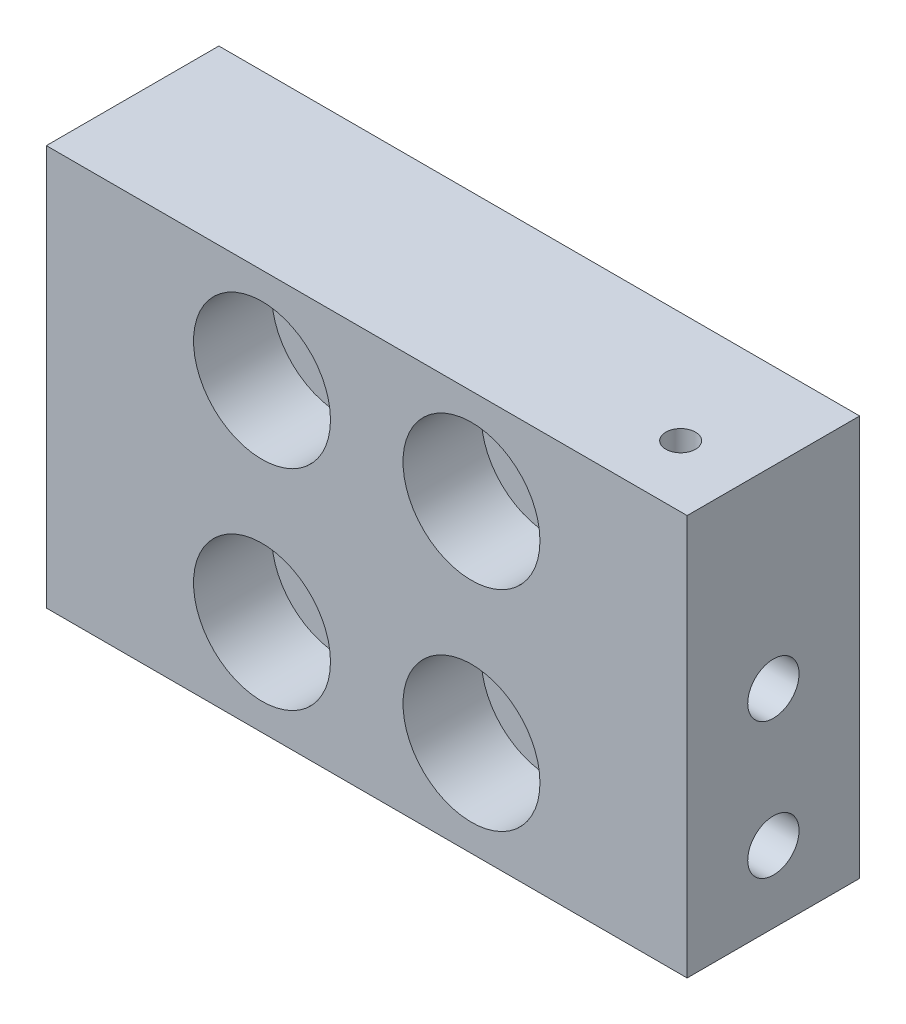
ISO-10303-21;
HEADER;
FILE_DESCRIPTION(('STEP AP214'),'2;1');
FILE_NAME('part.step','',(''),(''),'','','');
FILE_SCHEMA(('AUTOMOTIVE_DESIGN { 1 0 10303 214 1 1 1 1 }'));
ENDSEC;
DATA;
#1=APPLICATION_CONTEXT('core data for automotive mechanical design processes');
#2=APPLICATION_PROTOCOL_DEFINITION('international standard','automotive_design',2000,#1);
#3=PRODUCT_CONTEXT('',#1,'mechanical');
#4=PRODUCT('Part','Part','',(#3));
#5=PRODUCT_RELATED_PRODUCT_CATEGORY('part','',(#4));
#6=PRODUCT_DEFINITION_FORMATION('','',#4);
#7=PRODUCT_DEFINITION_CONTEXT('part definition',#1,'design');
#8=PRODUCT_DEFINITION('design','',#6,#7);
#9=PRODUCT_DEFINITION_SHAPE('','',#8);
#10=(LENGTH_UNIT() NAMED_UNIT(*) SI_UNIT(.MILLI.,.METRE.));
#11=(NAMED_UNIT(*) PLANE_ANGLE_UNIT() SI_UNIT($,.RADIAN.));
#12=(NAMED_UNIT(*) SI_UNIT($,.STERADIAN.) SOLID_ANGLE_UNIT());
#13=UNCERTAINTY_MEASURE_WITH_UNIT(LENGTH_MEASURE(1.E-05),#10,'distance_accuracy_value','');
#14=(GEOMETRIC_REPRESENTATION_CONTEXT(3) GLOBAL_UNCERTAINTY_ASSIGNED_CONTEXT((#13)) GLOBAL_UNIT_ASSIGNED_CONTEXT((#10,
#11,#12)) REPRESENTATION_CONTEXT('',''));
#15=CARTESIAN_POINT('',(0.,0.,0.));
#16=DIRECTION('',(0.,0.,1.));
#17=DIRECTION('',(1.,0.,0.));
#18=AXIS2_PLACEMENT_3D('',#15,#16,#17);
#19=CARTESIAN_POINT('',(11.9761,-16.25,9.));
#20=DIRECTION('',(0.,1.,0.));
#21=DIRECTION('',(0.,0.,1.));
#22=AXIS2_PLACEMENT_3D('',#19,#20,#21);
#23=CYLINDRICAL_SURFACE('',#22,1.2065);
#24=CARTESIAN_POINT('',(11.9761,-16.25,9.));
#25=DIRECTION('',(0.,1.,0.));
#26=DIRECTION('',(0.,0.,1.));
#27=AXIS2_PLACEMENT_3D('',#24,#25,#26);
#28=CIRCLE('',#27,1.2065);
#29=CARTESIAN_POINT('',(11.9761,-16.25,10.2065));
#30=VERTEX_POINT('',#29);
#31=EDGE_CURVE('E126',#30,#30,#28,.T.);
#32=ORIENTED_EDGE('',*,*,#31,.F.);
#33=EDGE_LOOP('',(#32));
#34=FACE_BOUND('',#33,.T.);
#35=CARTESIAN_POINT('',(11.9761,16.25,9.));
#36=DIRECTION('',(0.,1.,0.));
#37=DIRECTION('',(0.,0.,1.));
#38=AXIS2_PLACEMENT_3D('',#35,#36,#37);
#39=CIRCLE('',#38,1.2065);
#40=CARTESIAN_POINT('',(11.9761,16.25,10.2065));
#41=VERTEX_POINT('',#40);
#42=EDGE_CURVE('E125',#41,#41,#39,.T.);
#43=ORIENTED_EDGE('',*,*,#42,.T.);
#44=EDGE_LOOP('',(#43));
#45=FACE_BOUND('',#44,.T.);
#46=CARTESIAN_POINT('',(11.9761,-12.3611241729037,7.7935));
#47=CARTESIAN_POINT('',(12.0383119779317,-12.3611236387909,7.79349881396645));
#48=CARTESIAN_POINT('',(12.1005143925119,-12.3591562258355,7.79832668260524));
#49=CARTESIAN_POINT('',(12.2231668409252,-12.3511128608083,7.81743954220052));
#50=CARTESIAN_POINT('',(12.2836173712679,-12.3450380849368,7.83172182572965));
#51=CARTESIAN_POINT('',(12.4011007603259,-12.3282946631669,7.86915090768095));
#52=CARTESIAN_POINT('',(12.4581307024141,-12.3176221586285,7.8923051500785));
#53=CARTESIAN_POINT('',(12.5670447521251,-12.2910207306071,7.94637750279822));
#54=CARTESIAN_POINT('',(12.6189299995996,-12.2750929748702,7.97729388796464));
#55=CARTESIAN_POINT('',(12.715541819595,-12.2375659833419,8.04485523111553));
#56=CARTESIAN_POINT('',(12.7603460153974,-12.2160362716513,8.08142787822304));
#57=CARTESIAN_POINT('',(12.8425553175484,-12.1668598967251,8.15852834133076));
#58=CARTESIAN_POINT('',(12.879961185915,-12.1392138640845,8.19905574935305));
#59=CARTESIAN_POINT('',(12.9473173052903,-12.0775838741529,8.28217833544783));
#60=CARTESIAN_POINT('',(12.9772026674372,-12.0435489035243,8.3247879582766));
#61=CARTESIAN_POINT('',(13.0294618518609,-11.9697473311672,8.4096115711156));
#62=CARTESIAN_POINT('',(13.051832276449,-11.9299781484423,8.45182537380369));
#63=CARTESIAN_POINT('',(13.097098191719,-11.8294889962294,8.54955753410343));
#64=CARTESIAN_POINT('',(13.1170391797819,-11.7665080635163,8.60412250074922));
#65=CARTESIAN_POINT('',(13.1474918366299,-11.6329629439601,8.70617152492492));
#66=CARTESIAN_POINT('',(13.1579816694659,-11.5623816158427,8.75363897458048));
#67=CARTESIAN_POINT('',(13.1748809708069,-11.3938789773443,8.85242336437642));
#68=CARTESIAN_POINT('',(13.179194021647,-11.2940068400315,8.90079240055414));
#69=CARTESIAN_POINT('',(13.1821310557092,-11.139495405582,8.96096650496947));
#70=CARTESIAN_POINT('',(13.1825202645124,-11.08716636273,8.97897021874505));
#71=CARTESIAN_POINT('',(13.1826578821386,-10.9812452064991,9.01076033561725));
#72=CARTESIAN_POINT('',(13.1824065539403,-10.9276536204205,9.0245484668596));
#73=CARTESIAN_POINT('',(13.1817037111867,-10.818860884585,9.04796280139382));
#74=CARTESIAN_POINT('',(13.1812496869418,-10.7636479271729,9.0575337412958));
#75=CARTESIAN_POINT('',(13.180460523308,-10.6526462170997,9.07219500276255));
#76=CARTESIAN_POINT('',(13.1801253454501,-10.5968576567809,9.07728677495961));
#77=CARTESIAN_POINT('',(13.1797477338167,-10.4850393978561,9.08296098133241));
#78=CARTESIAN_POINT('',(13.1797053589444,-10.4290096529992,9.08354250818209));
#79=CARTESIAN_POINT('',(13.1799331855513,-10.3171035152043,9.08019097922646));
#80=CARTESIAN_POINT('',(13.1802032934259,-10.2612270813665,9.07625927536625));
#81=CARTESIAN_POINT('',(13.1809384786253,-10.1474502568247,9.06362869508976));
#82=CARTESIAN_POINT('',(13.1814118367997,-10.0895728981691,9.05472185585733));
#83=CARTESIAN_POINT('',(13.1822268730326,-9.97476682655516,9.03206724862103));
#84=CARTESIAN_POINT('',(13.1825685357618,-9.91783822476958,9.01831891742352));
#85=CARTESIAN_POINT('',(13.1826274637689,-9.80533541808021,8.98607580640679));
#86=CARTESIAN_POINT('',(13.1823447292764,-9.74976121267887,8.96758102833129));
#87=CARTESIAN_POINT('',(13.1805069595549,-9.64038375508712,8.92598854678094));
#88=CARTESIAN_POINT('',(13.1789517526071,-9.58658074293699,8.90289022238017));
#89=CARTESIAN_POINT('',(13.1723261437177,-9.45115387662476,8.83785713839302));
#90=CARTESIAN_POINT('',(13.1657593707839,-9.37111431333943,8.79268167643362));
#91=CARTESIAN_POINT('',(13.1439529520485,-9.21857286725036,8.69282371295792));
#92=CARTESIAN_POINT('',(13.1287314823338,-9.14605556284813,8.638161301998));
#93=CARTESIAN_POINT('',(13.0904790218146,-9.02608149687989,8.53513955113254));
#94=CARTESIAN_POINT('',(13.06998409935,-8.97666163024319,8.48813972383422));
#95=CARTESIAN_POINT('',(13.0197268069286,-8.88485152955717,8.39221027026685));
#96=CARTESIAN_POINT('',(12.9899702379862,-8.84245692065178,8.3432818686642));
#97=CARTESIAN_POINT('',(12.9199530649913,-8.76530648444544,8.24608403849458));
#98=CARTESIAN_POINT('',(12.8796176955222,-8.73060841029168,8.19782198310517));
#99=CARTESIAN_POINT('',(12.7886992862244,-8.66955831196966,8.10585507844628));
#100=CARTESIAN_POINT('',(12.7381196616154,-8.6432035138136,8.06214871773962));
#101=CARTESIAN_POINT('',(12.6346912458826,-8.60104870703754,7.98733933726073));
#102=CARTESIAN_POINT('',(12.5828340463822,-8.58436430724908,7.95535463689008));
#103=CARTESIAN_POINT('',(12.473710279291,-8.55643575098531,7.89918676157466));
#104=CARTESIAN_POINT('',(12.4164439625564,-8.54519134236976,7.87500322506808));
#105=CARTESIAN_POINT('',(12.2996424788821,-8.52766851156287,7.836099970585));
#106=CARTESIAN_POINT('',(12.240195050468,-8.52127711741912,7.82116655348251));
#107=CARTESIAN_POINT('',(12.1194358595113,-8.51253337229733,7.80047917230831));
#108=CARTESIAN_POINT('',(12.0581240295913,-8.51018116746813,7.79472554038673));
#109=CARTESIAN_POINT('',(11.9342888551643,-8.5093084902637,7.79260934459159));
#110=CARTESIAN_POINT('',(11.8717623100366,-8.51085234594718,7.79640443713456));
#111=CARTESIAN_POINT('',(11.7482735698928,-8.51804513411795,7.81356711170897));
#112=CARTESIAN_POINT('',(11.6873114425376,-8.52369424384823,7.82693510704696));
#113=CARTESIAN_POINT('',(11.5685888600515,-8.53957114113604,7.86271086382679));
#114=CARTESIAN_POINT('',(11.5108348274572,-8.54980776601762,7.88513606466612));
#115=CARTESIAN_POINT('',(11.400372888988,-8.57552316781073,7.93796153352725));
#116=CARTESIAN_POINT('',(11.3476635328762,-8.59100043230884,7.96835950009251));
#117=CARTESIAN_POINT('',(11.2495690491665,-8.62756261076003,8.03498499390508));
#118=CARTESIAN_POINT('',(11.2040799170064,-8.64855350378798,8.07111109136295));
#119=CARTESIAN_POINT('',(11.1204480728513,-8.69664419436279,8.1475262765263));
#120=CARTESIAN_POINT('',(11.0823044140844,-8.72374320364454,8.18781482669553));
#121=CARTESIAN_POINT('',(11.0135759536863,-8.78421904081054,8.27054755544945));
#122=CARTESIAN_POINT('',(10.9830336283603,-8.81762938858489,8.31300231728557));
#123=CARTESIAN_POINT('',(10.9294879045943,-8.8902131314091,8.39770300605257));
#124=CARTESIAN_POINT('',(10.9064878021128,-8.9293890352068,8.43994883375759));
#125=CARTESIAN_POINT('',(10.8600561888807,-9.02801503530024,8.53743010688584));
#126=CARTESIAN_POINT('',(10.839498895318,-9.08966243461326,8.59181396493464));
#127=CARTESIAN_POINT('',(10.8078641660125,-9.22052692402256,8.69383615798838));
#128=CARTESIAN_POINT('',(10.7968082511592,-9.28976080020903,8.74145897661204));
#129=CARTESIAN_POINT('',(10.778725755807,-9.45555235755235,8.84115784529109));
#130=CARTESIAN_POINT('',(10.7738815060513,-9.55410457669837,8.89033235810981));
#131=CARTESIAN_POINT('',(10.7703855699488,-9.70673525222016,8.95195896081184));
#132=CARTESIAN_POINT('',(10.7698497477498,-9.75845580097478,8.97048857932395));
#133=CARTESIAN_POINT('',(10.7694914467242,-9.86319712293093,9.00340811650867));
#134=CARTESIAN_POINT('',(10.7696686781475,-9.91621735929976,9.01779971412394));
#135=CARTESIAN_POINT('',(10.7702853348799,-10.0239710220619,9.04251875130013));
#136=CARTESIAN_POINT('',(10.7707283938557,-10.0787180390916,9.05278651201727));
#137=CARTESIAN_POINT('',(10.7715420170496,-10.1888426878129,9.06890315851663));
#138=CARTESIAN_POINT('',(10.7719126044134,-10.24422011217,9.07475345683517));
#139=CARTESIAN_POINT('',(10.7723844265525,-10.3552738948071,9.08200205897306));
#140=CARTESIAN_POINT('',(10.7724856269944,-10.4109502902852,9.08339979531408));
#141=CARTESIAN_POINT('',(10.7723714247494,-10.5222187128029,9.08173327190616));
#142=CARTESIAN_POINT('',(10.772156115723,-10.57781075993,9.0786703321471));
#143=CARTESIAN_POINT('',(10.771495273185,-10.6914319147729,9.06783120604967));
#144=CARTESIAN_POINT('',(10.7710384271584,-10.749438659161,9.05981984027984));
#145=CARTESIAN_POINT('',(10.7701835565862,-10.8645776092144,9.0389425264205));
#146=CARTESIAN_POINT('',(10.7697855387949,-10.9217097137862,9.02607602150181));
#147=CARTESIAN_POINT('',(10.7695115918356,-11.0347003919358,8.99557464186717));
#148=CARTESIAN_POINT('',(10.769635724389,-11.0905588141721,8.97793920366524));
#149=CARTESIAN_POINT('',(10.7710276911236,-11.2005819451539,8.93803519469192));
#150=CARTESIAN_POINT('',(10.7722957025577,-11.2547463900586,8.91576590628132));
#151=CARTESIAN_POINT('',(10.7780426212818,-11.3925859762127,8.85217200463999));
#152=CARTESIAN_POINT('',(10.7839826971093,-11.4746527610356,8.80739158026255));
#153=CARTESIAN_POINT('',(10.8044189562643,-11.631221974106,8.70781317183943));
#154=CARTESIAN_POINT('',(10.8188971756155,-11.7057399003082,8.65303638641766));
#155=CARTESIAN_POINT('',(10.8557774979678,-11.8287518220049,8.549681888407));
#156=CARTESIAN_POINT('',(10.8755689409421,-11.8792765650803,8.50260517407781));
#157=CARTESIAN_POINT('',(10.9244387146602,-11.9732832897793,8.4062316287071));
#158=CARTESIAN_POINT('',(10.9535111030611,-12.0167697510523,8.35693623552796));
#159=CARTESIAN_POINT('',(11.0223041789892,-12.096049476103,8.25869657016133));
#160=CARTESIAN_POINT('',(11.0621047119353,-12.1317812704478,8.20975787840219));
#161=CARTESIAN_POINT('',(11.1522011131425,-12.1947343948227,8.11623708971265));
#162=CARTESIAN_POINT('',(11.202492158449,-12.2219596213825,8.0716530045577));
#163=CARTESIAN_POINT('',(11.3053852432534,-12.265448221024,7.99532583493407));
#164=CARTESIAN_POINT('',(11.3569230260869,-12.2826535033987,7.96267546255783));
#165=CARTESIAN_POINT('',(11.4655824293314,-12.3115345642055,7.90510521567265));
#166=CARTESIAN_POINT('',(11.5227054939253,-12.3232089079206,7.88018734754102));
#167=CARTESIAN_POINT('',(11.6445664186653,-12.3423125041103,7.83804302379233));
#168=CARTESIAN_POINT('',(11.709557441338,-12.3494257831532,7.82140418998091));
#169=CARTESIAN_POINT('',(11.8417359618763,-12.3588320119163,7.79913307638889));
#170=CARTESIAN_POINT('',(11.908923556211,-12.3611247496382,7.79350128067807));
#171=CARTESIAN_POINT('',(11.9761,-12.3611241729037,7.7935));
#172=B_SPLINE_CURVE_WITH_KNOTS('',3,(#46,#47,#48,#49,#50,#51,#52,#53,#54,#55,#56,#57,#58,#59,
#60,#61,#62,#63,#64,#65,#66,#67,#68,#69,#70,#71,#72,#73,#74,#75,#76,#77,#78,#79,#80,#81,#82,#83,
#84,#85,#86,#87,#88,#89,#90,#91,#92,#93,#94,#95,#96,#97,#98,#99,#100,#101,#102,#103,#104,#105,
#106,#107,#108,#109,#110,#111,#112,#113,#114,#115,#116,#117,#118,#119,#120,#121,#122,#123,#124,
#125,#126,#127,#128,#129,#130,#131,#132,#133,#134,#135,#136,#137,#138,#139,#140,#141,#142,#143,
#144,#145,#146,#147,#148,#149,#150,#151,#152,#153,#154,#155,#156,#157,#158,#159,#160,#161,#162,
#163,#164,#165,#166,#167,#168,#169,#170,#171),.UNSPECIFIED.,.T.,.F.,(4,2,2,2,2,2,2,2,2,2,2,2,2,
2,2,2,2,2,2,2,2,2,2,2,2,2,2,2,2,2,2,2,2,2,2,2,2,2,2,2,2,2,2,2,2,2,2,2,2,2,2,2,2,2,2,2,2,2,2,2,2,
2,4),(0.,0.186401806859428,0.372750257570939,0.559255406670589,0.745719141168997,
0.929970800667106,1.11420347259521,1.29997508984819,1.48583058634046,1.7414454610358,
1.99764940509129,2.3289293526065,2.49482044113129,2.6606434324096,2.82857910079176,
2.99646036114565,3.16437539329704,3.33224013936858,3.50771213104172,3.68320454149728,
3.85869688748144,4.03421291989635,4.30957147233566,4.58435385765511,4.79715398264588,
5.00982108800295,5.22403373002698,5.43817507525297,5.62675433546043,5.8153248542979,
5.99935838678965,6.18339857797483,6.37049727844315,6.55760405731621,6.74507283582274,
6.93248755814427,7.11689331724739,7.30127529201513,7.48666556026505,7.67213673660573,
7.92493529406673,8.17830494948559,8.50717350421254,8.67187127950187,8.8365021364287,
9.00343634665379,9.17031715504197,9.33721923151238,9.50407192885578,9.6795392027708,
9.85502660690296,10.0305347552819,10.2060701046689,10.4860070435623,10.7653570950444,
10.9800307228843,11.1945671756516,11.4107466682866,11.6268269917932,11.8160488404204,
12.0053197460647,12.2065874161629,12.4078639374527),.UNSPECIFIED.);
#173=CARTESIAN_POINT('',(11.9761,-12.3611241729037,7.7935));
#174=VERTEX_POINT('',#173);
#175=EDGE_CURVE('E160',#174,#174,#172,.T.);
#176=ORIENTED_EDGE('',*,*,#175,.F.);
#177=EDGE_LOOP('',(#176));
#178=FACE_BOUND('',#177,.T.);
#179=CARTESIAN_POINT('',(11.9761,-1.33752417290366,7.7935));
#180=CARTESIAN_POINT('',(12.0383119779317,-1.33752363879088,7.79349881396645));
#181=CARTESIAN_POINT('',(12.1005143925119,-1.33555622583548,7.79832668260524));
#182=CARTESIAN_POINT('',(12.2231668409252,-1.32751286080826,7.81743954220052));
#183=CARTESIAN_POINT('',(12.2836173712679,-1.3214380849368,7.83172182572965));
#184=CARTESIAN_POINT('',(12.4011007603259,-1.30469466316687,7.86915090768095));
#185=CARTESIAN_POINT('',(12.4581307024141,-1.29402215862845,7.8923051500785));
#186=CARTESIAN_POINT('',(12.5670447521251,-1.26742073060709,7.94637750279822));
#187=CARTESIAN_POINT('',(12.6189299995996,-1.25149297487016,7.97729388796464));
#188=CARTESIAN_POINT('',(12.715541819595,-1.21396598334187,8.04485523111553));
#189=CARTESIAN_POINT('',(12.7603460153974,-1.19243627165134,8.08142787822304));
#190=CARTESIAN_POINT('',(12.8425553175484,-1.14325989672514,8.15852834133076));
#191=CARTESIAN_POINT('',(12.879961185915,-1.11561386408445,8.19905574935305));
#192=CARTESIAN_POINT('',(12.9473173052903,-1.05398387415285,8.28217833544783));
#193=CARTESIAN_POINT('',(12.9772026674372,-1.01994890352428,8.3247879582766));
#194=CARTESIAN_POINT('',(13.0294618518609,-0.946147331167149,8.4096115711156));
#195=CARTESIAN_POINT('',(13.051832276449,-0.906378148442319,8.45182537380369));
#196=CARTESIAN_POINT('',(13.097098191719,-0.805888996229398,8.54955753410343));
#197=CARTESIAN_POINT('',(13.1170391797819,-0.742908063516255,8.60412250074922));
#198=CARTESIAN_POINT('',(13.1474918366299,-0.609362943960055,8.70617152492492));
#199=CARTESIAN_POINT('',(13.1579816694659,-0.538781615842697,8.75363897458048));
#200=CARTESIAN_POINT('',(13.1748809708069,-0.370278977344246,8.85242336437642));
#201=CARTESIAN_POINT('',(13.179194021647,-0.270406840031512,8.90079240055414));
#202=CARTESIAN_POINT('',(13.1821310557092,-0.115895405582001,8.96096650496947));
#203=CARTESIAN_POINT('',(13.1825202645124,-0.0635663627299739,8.97897021874505));
#204=CARTESIAN_POINT('',(13.1826578821386,0.0423547935008736,9.01076033561725));
#205=CARTESIAN_POINT('',(13.1824065539403,0.0959463795794926,9.0245484668596));
#206=CARTESIAN_POINT('',(13.1817037111867,0.204739115414988,9.04796280139382));
#207=CARTESIAN_POINT('',(13.1812496869418,0.25995207282708,9.0575337412958));
#208=CARTESIAN_POINT('',(13.180460523308,0.370953782900275,9.07219500276255));
#209=CARTESIAN_POINT('',(13.1801253454501,0.426742343219074,9.07728677495961));
#210=CARTESIAN_POINT('',(13.1797477338167,0.538560602143896,9.08296098133241));
#211=CARTESIAN_POINT('',(13.1797053589444,0.594590347000839,9.08354250818209));
#212=CARTESIAN_POINT('',(13.1799331855513,0.706496484795753,9.08019097922646));
#213=CARTESIAN_POINT('',(13.1802032934259,0.76237291863355,9.07625927536625));
#214=CARTESIAN_POINT('',(13.1809384786253,0.876149743175353,9.06362869508976));
#215=CARTESIAN_POINT('',(13.1814118367997,0.934027101830917,9.05472185585733));
#216=CARTESIAN_POINT('',(13.1822268730326,1.04883317344484,9.03206724862103));
#217=CARTESIAN_POINT('',(13.1825685357618,1.10576177523043,9.01831891742352));
#218=CARTESIAN_POINT('',(13.1826274637689,1.2182645819198,8.98607580640678));
#219=CARTESIAN_POINT('',(13.1823447292764,1.27383878732114,8.96758102833129));
#220=CARTESIAN_POINT('',(13.1805069595549,1.38321624491288,8.92598854678094));
#221=CARTESIAN_POINT('',(13.1789517526071,1.43701925706302,8.90289022238016));
#222=CARTESIAN_POINT('',(13.1723261437177,1.57244612337525,8.83785713839302));
#223=CARTESIAN_POINT('',(13.1657593707839,1.65248568666057,8.79268167643362));
#224=CARTESIAN_POINT('',(13.1439529520485,1.80502713274964,8.69282371295792));
#225=CARTESIAN_POINT('',(13.1287314823338,1.87754443715187,8.638161301998));
#226=CARTESIAN_POINT('',(13.0904790218146,1.99751850312011,8.53513955113254));
#227=CARTESIAN_POINT('',(13.06998409935,2.04693836975681,8.48813972383422));
#228=CARTESIAN_POINT('',(13.0197268069286,2.13874847044284,8.39221027026685));
#229=CARTESIAN_POINT('',(12.9899702379862,2.18114307934822,8.3432818686642));
#230=CARTESIAN_POINT('',(12.9199530649913,2.25829351555456,8.24608403849458));
#231=CARTESIAN_POINT('',(12.8796176955222,2.29299158970832,8.19782198310517));
#232=CARTESIAN_POINT('',(12.7886992862244,2.35404168803034,8.10585507844628));
#233=CARTESIAN_POINT('',(12.7381196616154,2.3803964861864,8.06214871773962));
#234=CARTESIAN_POINT('',(12.6346912458826,2.42255129296246,7.98733933726073));
#235=CARTESIAN_POINT('',(12.5828340463822,2.43923569275092,7.95535463689008));
#236=CARTESIAN_POINT('',(12.473710279291,2.46716424901469,7.89918676157466));
#237=CARTESIAN_POINT('',(12.4164439625564,2.47840865763024,7.87500322506808));
#238=CARTESIAN_POINT('',(12.2996424788821,2.49593148843714,7.836099970585));
#239=CARTESIAN_POINT('',(12.240195050468,2.50232288258088,7.82116655348251));
#240=CARTESIAN_POINT('',(12.1194358595113,2.51106662770268,7.80047917230831));
#241=CARTESIAN_POINT('',(12.0581240295913,2.51341883253187,7.79472554038673));
#242=CARTESIAN_POINT('',(11.9342888551643,2.5142915097363,7.79260934459159));
#243=CARTESIAN_POINT('',(11.8717623100366,2.51274765405282,7.79640443713456));
#244=CARTESIAN_POINT('',(11.7482735698928,2.50555486588205,7.81356711170897));
#245=CARTESIAN_POINT('',(11.6873114425376,2.49990575615177,7.82693510704696));
#246=CARTESIAN_POINT('',(11.5685888600515,2.48402885886396,7.86271086382679));
#247=CARTESIAN_POINT('',(11.5108348274572,2.47379223398238,7.88513606466612));
#248=CARTESIAN_POINT('',(11.400372888988,2.44807683218927,7.93796153352725));
#249=CARTESIAN_POINT('',(11.3476635328762,2.43259956769116,7.96835950009251));
#250=CARTESIAN_POINT('',(11.2495690491665,2.39603738923997,8.03498499390508));
#251=CARTESIAN_POINT('',(11.2040799170064,2.37504649621203,8.07111109136295));
#252=CARTESIAN_POINT('',(11.1204480728513,2.32695580563721,8.1475262765263));
#253=CARTESIAN_POINT('',(11.0823044140844,2.29985679635546,8.18781482669553));
#254=CARTESIAN_POINT('',(11.0135759536863,2.23938095918946,8.27054755544945));
#255=CARTESIAN_POINT('',(10.9830336283603,2.20597061141511,8.31300231728557));
#256=CARTESIAN_POINT('',(10.9294879045943,2.1333868685909,8.39770300605257));
#257=CARTESIAN_POINT('',(10.9064878021128,2.0942109647932,8.43994883375759));
#258=CARTESIAN_POINT('',(10.8600561888807,1.99558496469977,8.53743010688584));
#259=CARTESIAN_POINT('',(10.839498895318,1.93393756538675,8.59181396493464));
#260=CARTESIAN_POINT('',(10.8078641660125,1.80307307597744,8.69383615798838));
#261=CARTESIAN_POINT('',(10.7968082511592,1.73383919979097,8.74145897661204));
#262=CARTESIAN_POINT('',(10.778725755807,1.56804764244765,8.84115784529109));
#263=CARTESIAN_POINT('',(10.7738815060513,1.46949542330162,8.89033235810981));
#264=CARTESIAN_POINT('',(10.7703855699488,1.31686474777984,8.95195896081184));
#265=CARTESIAN_POINT('',(10.7698497477498,1.26514419902522,8.97048857932395));
#266=CARTESIAN_POINT('',(10.7694914467242,1.16040287706907,9.00340811650867));
#267=CARTESIAN_POINT('',(10.7696686781475,1.10738264070025,9.01779971412394));
#268=CARTESIAN_POINT('',(10.7702853348799,0.999628977938054,9.04251875130013));
#269=CARTESIAN_POINT('',(10.7707283938557,0.94488196090842,9.05278651201727));
#270=CARTESIAN_POINT('',(10.7715420170496,0.834757312187129,9.06890315851663));
#271=CARTESIAN_POINT('',(10.7719126044134,0.779379887830031,9.07475345683517));
#272=CARTESIAN_POINT('',(10.7723844265525,0.668326105192919,9.08200205897306));
#273=CARTESIAN_POINT('',(10.7724856269944,0.612649709714796,9.08339979531408));
#274=CARTESIAN_POINT('',(10.7723714247494,0.501381287197125,9.08173327190616));
#275=CARTESIAN_POINT('',(10.772156115723,0.445789240070022,9.0786703321471));
#276=CARTESIAN_POINT('',(10.771495273185,0.332168085227137,9.06783120604967));
#277=CARTESIAN_POINT('',(10.7710384271584,0.274161340839019,9.05981984027984));
#278=CARTESIAN_POINT('',(10.7701835565862,0.159022390785575,9.0389425264205));
#279=CARTESIAN_POINT('',(10.7697855387949,0.101890286213833,9.02607602150181));
#280=CARTESIAN_POINT('',(10.7695115918356,-0.0111003919358057,8.99557464186717));
#281=CARTESIAN_POINT('',(10.769635724389,-0.0669588141721376,8.97793920366524));
#282=CARTESIAN_POINT('',(10.7710276911236,-0.176981945153889,8.93803519469192));
#283=CARTESIAN_POINT('',(10.7722957025577,-0.231146390058577,8.91576590628132));
#284=CARTESIAN_POINT('',(10.7780426212818,-0.368985976212688,8.85217200464));
#285=CARTESIAN_POINT('',(10.7839826971093,-0.451052761035571,8.80739158026255));
#286=CARTESIAN_POINT('',(10.8044189562643,-0.607621974106028,8.70781317183943));
#287=CARTESIAN_POINT('',(10.8188971756155,-0.682139900308188,8.65303638641766));
#288=CARTESIAN_POINT('',(10.8557774979678,-0.805151822004866,8.549681888407));
#289=CARTESIAN_POINT('',(10.8755689409421,-0.855676565080313,8.50260517407781));
#290=CARTESIAN_POINT('',(10.9244387146602,-0.949683289779268,8.4062316287071));
#291=CARTESIAN_POINT('',(10.9535111030611,-0.993169751052314,8.35693623552797));
#292=CARTESIAN_POINT('',(11.0223041789892,-1.07244947610301,8.25869657016134));
#293=CARTESIAN_POINT('',(11.0621047119353,-1.10818127044777,8.2097578784022));
#294=CARTESIAN_POINT('',(11.1522011131425,-1.17113439482271,8.11623708971266));
#295=CARTESIAN_POINT('',(11.202492158449,-1.19835962138253,8.07165300455771));
#296=CARTESIAN_POINT('',(11.3053852432534,-1.24184822102398,7.99532583493407));
#297=CARTESIAN_POINT('',(11.3569230260869,-1.25905350339869,7.96267546255784));
#298=CARTESIAN_POINT('',(11.4655824293314,-1.28793456420549,7.90510521567265));
#299=CARTESIAN_POINT('',(11.5227054939253,-1.29960890792062,7.88018734754103));
#300=CARTESIAN_POINT('',(11.6445664186653,-1.31871250411031,7.83804302379233));
#301=CARTESIAN_POINT('',(11.709557441338,-1.32582578315315,7.82140418998091));
#302=CARTESIAN_POINT('',(11.8417359618763,-1.3352320119163,7.79913307638889));
#303=CARTESIAN_POINT('',(11.908923556211,-1.3375247496382,7.79350128067807));
#304=CARTESIAN_POINT('',(11.9761,-1.33752417290366,7.7935));
#305=B_SPLINE_CURVE_WITH_KNOTS('',3,(#179,#180,#181,#182,#183,#184,#185,#186,#187,#188,#189,
#190,#191,#192,#193,#194,#195,#196,#197,#198,#199,#200,#201,#202,#203,#204,#205,#206,#207,#208,
#209,#210,#211,#212,#213,#214,#215,#216,#217,#218,#219,#220,#221,#222,#223,#224,#225,#226,#227,
#228,#229,#230,#231,#232,#233,#234,#235,#236,#237,#238,#239,#240,#241,#242,#243,#244,#245,#246,
#247,#248,#249,#250,#251,#252,#253,#254,#255,#256,#257,#258,#259,#260,#261,#262,#263,#264,#265,
#266,#267,#268,#269,#270,#271,#272,#273,#274,#275,#276,#277,#278,#279,#280,#281,#282,#283,#284,
#285,#286,#287,#288,#289,#290,#291,#292,#293,#294,#295,#296,#297,#298,#299,#300,#301,#302,#303,
#304),.UNSPECIFIED.,.T.,.F.,(4,2,2,2,2,2,2,2,2,2,2,2,2,2,2,2,2,2,2,2,2,2,2,2,2,2,2,2,2,2,2,2,2,
2,2,2,2,2,2,2,2,2,2,2,2,2,2,2,2,2,2,2,2,2,2,2,2,2,2,2,2,2,4),(0.,0.186401806859428,
0.372750257570939,0.559255406670588,0.745719141168997,0.929970800667106,1.11420347259521,
1.29997508984818,1.48583058634046,1.74144546103581,1.9976494050913,2.32892935260651,
2.49482044113129,2.6606434324096,2.82857910079176,2.99646036114566,3.16437539329704,
3.33224013936859,3.50771213104173,3.68320454149728,3.85869688748145,4.03421291989635,
4.30957147233566,4.58435385765511,4.79715398264589,5.00982108800296,5.22403373002698,
5.43817507525297,5.62675433546042,5.8153248542979,5.99935838678965,6.18339857797483,
6.37049727844315,6.55760405731621,6.74507283582274,6.93248755814427,7.11689331724739,
7.30127529201513,7.48666556026505,7.67213673660573,7.92493529406672,8.17830494948559,
8.50717350421254,8.67187127950187,8.8365021364287,9.00343634665378,9.17031715504196,
9.33721923151237,9.50407192885577,9.67953920277079,9.85502660690295,10.0305347552819,
10.2060701046689,10.4860070435623,10.7653570950444,10.9800307228842,11.1945671756516,
11.4107466682866,11.6268269917932,11.8160488404204,12.0053197460647,12.2065874161628,
12.4078639374526),.UNSPECIFIED.);
#306=CARTESIAN_POINT('',(11.9761,-1.33752417290366,7.7935));
#307=VERTEX_POINT('',#306);
#308=EDGE_CURVE('E52',#307,#307,#305,.T.);
#309=ORIENTED_EDGE('',*,*,#308,.F.);
#310=EDGE_LOOP('',(#309));
#311=FACE_BOUND('',#310,.T.);
#312=ADVANCED_FACE('F48',(#34,#45,#178,#311),#23,.F.);
#313=CARTESIAN_POINT('',(0.,0.,0.));
#314=DIRECTION('',(0.,0.,-1.));
#315=DIRECTION('',(-1.,0.,0.));
#316=AXIS2_PLACEMENT_3D('',#313,#314,#315);
#317=PLANE('',#316);
#318=CARTESIAN_POINT('',(-17.,8.5,0.));
#319=DIRECTION('',(0.,0.,1.));
#320=DIRECTION('',(1.,0.,0.));
#321=AXIS2_PLACEMENT_3D('',#318,#319,#320);
#322=CIRCLE('',#321,3.3782);
#323=CARTESIAN_POINT('',(-13.6218,8.5,0.));
#324=VERTEX_POINT('',#323);
#325=EDGE_CURVE('E263',#324,#324,#322,.T.);
#326=ORIENTED_EDGE('',*,*,#325,.T.);
#327=EDGE_LOOP('',(#326));
#328=FACE_BOUND('',#327,.T.);
#329=DIRECTION('',(0.,1.,0.));
#330=VECTOR('',#329,1.);
#331=CARTESIAN_POINT('',(17.5,-16.25,0.));
#332=LINE('',#331,#330);
#333=CARTESIAN_POINT('',(17.5,-16.25,0.));
#334=VERTEX_POINT('',#333);
#335=CARTESIAN_POINT('',(17.5,16.25,0.));
#336=VERTEX_POINT('',#335);
#337=EDGE_CURVE('E105',#334,#336,#332,.T.);
#338=ORIENTED_EDGE('',*,*,#337,.F.);
#339=DIRECTION('',(1.,0.,0.));
#340=VECTOR('',#339,1.);
#341=CARTESIAN_POINT('',(-17.5,-16.25,0.));
#342=LINE('',#341,#340);
#343=CARTESIAN_POINT('',(-34.5,-16.25,0.));
#344=VERTEX_POINT('',#343);
#345=EDGE_CURVE('E97',#344,#334,#342,.T.);
#346=ORIENTED_EDGE('',*,*,#345,.F.);
#347=DIRECTION('',(0.,-1.,0.));
#348=VECTOR('',#347,1.);
#349=CARTESIAN_POINT('',(-34.5,-16.25,0.));
#350=LINE('',#349,#348);
#351=CARTESIAN_POINT('',(-34.5,16.25,0.));
#352=VERTEX_POINT('',#351);
#353=EDGE_CURVE('E102',#352,#344,#350,.T.);
#354=ORIENTED_EDGE('',*,*,#353,.F.);
#355=DIRECTION('',(-1.,0.,0.));
#356=VECTOR('',#355,1.);
#357=CARTESIAN_POINT('',(-17.5,16.25,0.));
#358=LINE('',#357,#356);
#359=EDGE_CURVE('E84',#336,#352,#358,.T.);
#360=ORIENTED_EDGE('',*,*,#359,.F.);
#361=EDGE_LOOP('',(#338,#346,#354,#360));
#362=FACE_BOUND('',#361,.T.);
#363=CARTESIAN_POINT('',(0.,8.5,0.));
#364=DIRECTION('',(0.,0.,1.));
#365=DIRECTION('',(1.,0.,0.));
#366=AXIS2_PLACEMENT_3D('',#363,#364,#365);
#367=CIRCLE('',#366,3.3782);
#368=CARTESIAN_POINT('',(3.3782,8.5,0.));
#369=VERTEX_POINT('',#368);
#370=EDGE_CURVE('E152',#369,#369,#367,.T.);
#371=ORIENTED_EDGE('',*,*,#370,.T.);
#372=EDGE_LOOP('',(#371));
#373=FACE_BOUND('',#372,.T.);
#374=CARTESIAN_POINT('',(0.,-8.5,0.));
#375=DIRECTION('',(0.,0.,1.));
#376=DIRECTION('',(1.,0.,0.));
#377=AXIS2_PLACEMENT_3D('',#374,#375,#376);
#378=CIRCLE('',#377,3.3782);
#379=CARTESIAN_POINT('',(3.3782,-8.5,0.));
#380=VERTEX_POINT('',#379);
#381=EDGE_CURVE('E140',#380,#380,#378,.T.);
#382=ORIENTED_EDGE('',*,*,#381,.T.);
#383=EDGE_LOOP('',(#382));
#384=FACE_BOUND('',#383,.T.);
#385=CARTESIAN_POINT('',(-17.,-8.5,0.));
#386=DIRECTION('',(0.,0.,1.));
#387=DIRECTION('',(1.,0.,0.));
#388=AXIS2_PLACEMENT_3D('',#385,#386,#387);
#389=CIRCLE('',#388,3.3782);
#390=CARTESIAN_POINT('',(-13.6218,-8.5,0.));
#391=VERTEX_POINT('',#390);
#392=EDGE_CURVE('E120',#391,#391,#389,.T.);
#393=ORIENTED_EDGE('',*,*,#392,.T.);
#394=EDGE_LOOP('',(#393));
#395=FACE_BOUND('',#394,.T.);
#396=ADVANCED_FACE('F99',(#328,#362,#373,#384,#395),#317,.T.);
#397=CARTESIAN_POINT('',(17.5,-16.25,14.));
#398=DIRECTION('',(-1.,0.,0.));
#399=DIRECTION('',(0.,0.,1.));
#400=AXIS2_PLACEMENT_3D('',#397,#398,#399);
#401=PLANE('',#400);
#402=CARTESIAN_POINT('',(17.5,0.588199999972396,6.99999999999946));
#403=DIRECTION('',(-1.,0.,0.));
#404=DIRECTION('',(0.,0.,1.));
#405=AXIS2_PLACEMENT_3D('',#402,#403,#404);
#406=CIRCLE('',#405,2.0828);
#407=CARTESIAN_POINT('',(17.5,0.588199999972396,9.08279999999946));
#408=VERTEX_POINT('',#407);
#409=EDGE_CURVE('E477',#408,#408,#406,.T.);
#410=ORIENTED_EDGE('',*,*,#409,.T.);
#411=EDGE_LOOP('',(#410));
#412=FACE_BOUND('',#411,.T.);
#413=CARTESIAN_POINT('',(17.5,-10.4354000000276,6.99999999999946));
#414=DIRECTION('',(-1.,0.,0.));
#415=DIRECTION('',(0.,0.,1.));
#416=AXIS2_PLACEMENT_3D('',#413,#414,#415);
#417=CIRCLE('',#416,2.0828);
#418=CARTESIAN_POINT('',(17.5,-10.4354000000276,9.08279999999946));
#419=VERTEX_POINT('',#418);
#420=EDGE_CURVE('E485',#419,#419,#417,.T.);
#421=ORIENTED_EDGE('',*,*,#420,.T.);
#422=EDGE_LOOP('',(#421));
#423=FACE_BOUND('',#422,.T.);
#424=ORIENTED_EDGE('',*,*,#337,.T.);
#425=DIRECTION('',(0.,0.,-1.));
#426=VECTOR('',#425,1.);
#427=CARTESIAN_POINT('',(17.5,16.25,14.));
#428=LINE('',#427,#426);
#429=CARTESIAN_POINT('',(17.5,16.25,14.));
#430=VERTEX_POINT('',#429);
#431=EDGE_CURVE('E13',#430,#336,#428,.T.);
#432=ORIENTED_EDGE('',*,*,#431,.F.);
#433=DIRECTION('',(0.,1.,0.));
#434=VECTOR('',#433,1.);
#435=CARTESIAN_POINT('',(17.5,-16.25,14.));
#436=LINE('',#435,#434);
#437=CARTESIAN_POINT('',(17.5,-16.25,14.));
#438=VERTEX_POINT('',#437);
#439=EDGE_CURVE('E108',#438,#430,#436,.T.);
#440=ORIENTED_EDGE('',*,*,#439,.F.);
#441=DIRECTION('',(0.,0.,-1.));
#442=VECTOR('',#441,1.);
#443=CARTESIAN_POINT('',(17.5,-16.25,14.));
#444=LINE('',#443,#442);
#445=EDGE_CURVE('E63',#438,#334,#444,.T.);
#446=ORIENTED_EDGE('',*,*,#445,.T.);
#447=EDGE_LOOP('',(#424,#432,#440,#446));
#448=FACE_BOUND('',#447,.T.);
#449=ADVANCED_FACE('F50',(#412,#423,#448),#401,.F.);
#450=CARTESIAN_POINT('',(-17.5,16.25,14.));
#451=DIRECTION('',(0.,-1.,0.));
#452=DIRECTION('',(0.,0.,-1.));
#453=AXIS2_PLACEMENT_3D('',#450,#451,#452);
#454=PLANE('',#453);
#455=ORIENTED_EDGE('',*,*,#42,.F.);
#456=EDGE_LOOP('',(#455));
#457=FACE_BOUND('',#456,.T.);
#458=ORIENTED_EDGE('',*,*,#359,.T.);
#459=DIRECTION('',(0.,0.,1.));
#460=VECTOR('',#459,1.);
#461=CARTESIAN_POINT('',(-34.5,16.25,-36.6776498701866));
#462=LINE('',#461,#460);
#463=CARTESIAN_POINT('',(-34.5,16.25,14.));
#464=VERTEX_POINT('',#463);
#465=EDGE_CURVE('E115',#352,#464,#462,.T.);
#466=ORIENTED_EDGE('',*,*,#465,.T.);
#467=DIRECTION('',(-1.,0.,0.));
#468=VECTOR('',#467,1.);
#469=CARTESIAN_POINT('',(-17.5,16.25,14.));
#470=LINE('',#469,#468);
#471=EDGE_CURVE('E89',#430,#464,#470,.T.);
#472=ORIENTED_EDGE('',*,*,#471,.F.);
#473=ORIENTED_EDGE('',*,*,#431,.T.);
#474=EDGE_LOOP('',(#458,#466,#472,#473));
#475=FACE_BOUND('',#474,.T.);
#476=ADVANCED_FACE('F296',(#457,#475),#454,.F.);
#477=CARTESIAN_POINT('',(-17.5,-16.25,14.));
#478=DIRECTION('',(0.,1.,0.));
#479=DIRECTION('',(0.,0.,1.));
#480=AXIS2_PLACEMENT_3D('',#477,#478,#479);
#481=PLANE('',#480);
#482=ORIENTED_EDGE('',*,*,#31,.T.);
#483=EDGE_LOOP('',(#482));
#484=FACE_BOUND('',#483,.T.);
#485=ORIENTED_EDGE('',*,*,#345,.T.);
#486=ORIENTED_EDGE('',*,*,#445,.F.);
#487=DIRECTION('',(1.,0.,0.));
#488=VECTOR('',#487,1.);
#489=CARTESIAN_POINT('',(-17.5,-16.25,14.));
#490=LINE('',#489,#488);
#491=CARTESIAN_POINT('',(-34.5,-16.25,14.));
#492=VERTEX_POINT('',#491);
#493=EDGE_CURVE('E72',#492,#438,#490,.T.);
#494=ORIENTED_EDGE('',*,*,#493,.F.);
#495=DIRECTION('',(0.,0.,1.));
#496=VECTOR('',#495,1.);
#497=CARTESIAN_POINT('',(-34.5,-16.25,-36.6776498701866));
#498=LINE('',#497,#496);
#499=EDGE_CURVE('E111',#344,#492,#498,.T.);
#500=ORIENTED_EDGE('',*,*,#499,.F.);
#501=EDGE_LOOP('',(#485,#486,#494,#500));
#502=FACE_BOUND('',#501,.T.);
#503=ADVANCED_FACE('F112',(#484,#502),#481,.F.);
#504=CARTESIAN_POINT('',(0.,0.,14.));
#505=DIRECTION('',(0.,0.,-1.));
#506=DIRECTION('',(-1.,0.,0.));
#507=AXIS2_PLACEMENT_3D('',#504,#505,#506);
#508=PLANE('',#507);
#509=CARTESIAN_POINT('',(-17.,8.5,14.));
#510=DIRECTION('',(0.,0.,1.));
#511=DIRECTION('',(1.,0.,0.));
#512=AXIS2_PLACEMENT_3D('',#509,#510,#511);
#513=CIRCLE('',#512,5.55625);
#514=CARTESIAN_POINT('',(-11.44375,8.5,14.));
#515=VERTEX_POINT('',#514);
#516=EDGE_CURVE('E253',#515,#515,#513,.T.);
#517=ORIENTED_EDGE('',*,*,#516,.F.);
#518=EDGE_LOOP('',(#517));
#519=FACE_BOUND('',#518,.T.);
#520=CARTESIAN_POINT('',(-17.,-8.5,14.));
#521=DIRECTION('',(0.,0.,1.));
#522=DIRECTION('',(1.,0.,0.));
#523=AXIS2_PLACEMENT_3D('',#520,#521,#522);
#524=CIRCLE('',#523,5.55625);
#525=CARTESIAN_POINT('',(-11.44375,-8.5,14.));
#526=VERTEX_POINT('',#525);
#527=EDGE_CURVE('E266',#526,#526,#524,.T.);
#528=ORIENTED_EDGE('',*,*,#527,.F.);
#529=EDGE_LOOP('',(#528));
#530=FACE_BOUND('',#529,.T.);
#531=CARTESIAN_POINT('',(0.,-8.5,14.));
#532=DIRECTION('',(0.,0.,1.));
#533=DIRECTION('',(1.,0.,0.));
#534=AXIS2_PLACEMENT_3D('',#531,#532,#533);
#535=CIRCLE('',#534,5.55625);
#536=CARTESIAN_POINT('',(5.55625,-8.5,14.));
#537=VERTEX_POINT('',#536);
#538=EDGE_CURVE('E129',#537,#537,#535,.T.);
#539=ORIENTED_EDGE('',*,*,#538,.F.);
#540=EDGE_LOOP('',(#539));
#541=FACE_BOUND('',#540,.T.);
#542=CARTESIAN_POINT('',(0.,8.5,14.));
#543=DIRECTION('',(0.,0.,1.));
#544=DIRECTION('',(1.,0.,0.));
#545=AXIS2_PLACEMENT_3D('',#542,#543,#544);
#546=CIRCLE('',#545,5.55625);
#547=CARTESIAN_POINT('',(5.55625,8.5,14.));
#548=VERTEX_POINT('',#547);
#549=EDGE_CURVE('E143',#548,#548,#546,.T.);
#550=ORIENTED_EDGE('',*,*,#549,.F.);
#551=EDGE_LOOP('',(#550));
#552=FACE_BOUND('',#551,.T.);
#553=ORIENTED_EDGE('',*,*,#439,.T.);
#554=ORIENTED_EDGE('',*,*,#471,.T.);
#555=DIRECTION('',(0.,-1.,0.));
#556=VECTOR('',#555,1.);
#557=CARTESIAN_POINT('',(-34.5,-16.25,14.));
#558=LINE('',#557,#556);
#559=EDGE_CURVE('E118',#464,#492,#558,.T.);
#560=ORIENTED_EDGE('',*,*,#559,.T.);
#561=ORIENTED_EDGE('',*,*,#493,.T.);
#562=EDGE_LOOP('',(#553,#554,#560,#561));
#563=FACE_BOUND('',#562,.T.);
#564=ADVANCED_FACE('F284',(#519,#530,#541,#552,#563),#508,.F.);
#565=CARTESIAN_POINT('',(0.,8.5,14.));
#566=DIRECTION('',(0.,0.,1.));
#567=DIRECTION('',(1.,0.,0.));
#568=AXIS2_PLACEMENT_3D('',#565,#566,#567);
#569=CYLINDRICAL_SURFACE('',#568,3.3782);
#570=ORIENTED_EDGE('',*,*,#370,.F.);
#571=EDGE_LOOP('',(#570));
#572=FACE_BOUND('',#571,.T.);
#573=CARTESIAN_POINT('',(0.,8.5,7.65));
#574=DIRECTION('',(0.,0.,1.));
#575=DIRECTION('',(1.,0.,0.));
#576=AXIS2_PLACEMENT_3D('',#573,#574,#575);
#577=CIRCLE('',#576,3.3782);
#578=CARTESIAN_POINT('',(3.3782,8.5,7.65));
#579=VERTEX_POINT('',#578);
#580=EDGE_CURVE('E149',#579,#579,#577,.T.);
#581=ORIENTED_EDGE('',*,*,#580,.T.);
#582=EDGE_LOOP('',(#581));
#583=FACE_BOUND('',#582,.T.);
#584=ADVANCED_FACE('F287',(#572,#583),#569,.F.);
#585=CARTESIAN_POINT('',(3.3782,8.5,7.65));
#586=DIRECTION('',(0.,0.,-1.));
#587=DIRECTION('',(-1.,0.,0.));
#588=AXIS2_PLACEMENT_3D('',#585,#586,#587);
#589=PLANE('',#588);
#590=ORIENTED_EDGE('',*,*,#580,.F.);
#591=EDGE_LOOP('',(#590));
#592=FACE_BOUND('',#591,.T.);
#593=CARTESIAN_POINT('',(0.,8.5,7.65));
#594=DIRECTION('',(0.,0.,1.));
#595=DIRECTION('',(1.,0.,0.));
#596=AXIS2_PLACEMENT_3D('',#593,#594,#595);
#597=CIRCLE('',#596,5.55625);
#598=CARTESIAN_POINT('',(5.55625,8.5,7.65));
#599=VERTEX_POINT('',#598);
#600=EDGE_CURVE('E146',#599,#599,#597,.T.);
#601=ORIENTED_EDGE('',*,*,#600,.T.);
#602=EDGE_LOOP('',(#601));
#603=FACE_BOUND('',#602,.T.);
#604=ADVANCED_FACE('F309',(#592,#603),#589,.F.);
#605=CARTESIAN_POINT('',(0.,8.5,14.));
#606=DIRECTION('',(0.,0.,1.));
#607=DIRECTION('',(1.,0.,0.));
#608=AXIS2_PLACEMENT_3D('',#605,#606,#607);
#609=CYLINDRICAL_SURFACE('',#608,5.55625);
#610=ORIENTED_EDGE('',*,*,#600,.F.);
#611=EDGE_LOOP('',(#610));
#612=FACE_BOUND('',#611,.T.);
#613=ORIENTED_EDGE('',*,*,#549,.T.);
#614=EDGE_LOOP('',(#613));
#615=FACE_BOUND('',#614,.T.);
#616=ADVANCED_FACE('F313',(#612,#615),#609,.F.);
#617=CARTESIAN_POINT('',(0.,-8.5,14.));
#618=DIRECTION('',(0.,0.,1.));
#619=DIRECTION('',(1.,0.,0.));
#620=AXIS2_PLACEMENT_3D('',#617,#618,#619);
#621=CYLINDRICAL_SURFACE('',#620,3.3782);
#622=ORIENTED_EDGE('',*,*,#381,.F.);
#623=EDGE_LOOP('',(#622));
#624=FACE_BOUND('',#623,.T.);
#625=CARTESIAN_POINT('',(0.,-8.5,7.65));
#626=DIRECTION('',(0.,0.,1.));
#627=DIRECTION('',(1.,0.,0.));
#628=AXIS2_PLACEMENT_3D('',#625,#626,#627);
#629=CIRCLE('',#628,3.3782);
#630=CARTESIAN_POINT('',(3.3782,-8.5,7.65));
#631=VERTEX_POINT('',#630);
#632=EDGE_CURVE('E137',#631,#631,#629,.T.);
#633=ORIENTED_EDGE('',*,*,#632,.T.);
#634=EDGE_LOOP('',(#633));
#635=FACE_BOUND('',#634,.T.);
#636=ADVANCED_FACE('F317',(#624,#635),#621,.F.);
#637=CARTESIAN_POINT('',(3.3782,-8.5,7.65));
#638=DIRECTION('',(0.,0.,-1.));
#639=DIRECTION('',(-1.,0.,0.));
#640=AXIS2_PLACEMENT_3D('',#637,#638,#639);
#641=PLANE('',#640);
#642=ORIENTED_EDGE('',*,*,#632,.F.);
#643=EDGE_LOOP('',(#642));
#644=FACE_BOUND('',#643,.T.);
#645=CARTESIAN_POINT('',(0.,-8.5,7.65));
#646=DIRECTION('',(0.,0.,1.));
#647=DIRECTION('',(1.,0.,0.));
#648=AXIS2_PLACEMENT_3D('',#645,#646,#647);
#649=CIRCLE('',#648,5.55625);
#650=CARTESIAN_POINT('',(5.55625,-8.5,7.65));
#651=VERTEX_POINT('',#650);
#652=EDGE_CURVE('E134',#651,#651,#649,.T.);
#653=ORIENTED_EDGE('',*,*,#652,.T.);
#654=EDGE_LOOP('',(#653));
#655=FACE_BOUND('',#654,.T.);
#656=ADVANCED_FACE('F222',(#644,#655),#641,.F.);
#657=CARTESIAN_POINT('',(0.,-8.5,14.));
#658=DIRECTION('',(0.,0.,1.));
#659=DIRECTION('',(1.,0.,0.));
#660=AXIS2_PLACEMENT_3D('',#657,#658,#659);
#661=CYLINDRICAL_SURFACE('',#660,5.55625);
#662=ORIENTED_EDGE('',*,*,#652,.F.);
#663=EDGE_LOOP('',(#662));
#664=FACE_BOUND('',#663,.T.);
#665=ORIENTED_EDGE('',*,*,#538,.T.);
#666=EDGE_LOOP('',(#665));
#667=FACE_BOUND('',#666,.T.);
#668=ADVANCED_FACE('F217',(#664,#667),#661,.F.);
#669=CARTESIAN_POINT('',(-34.5,-16.25,-36.6776498701866));
#670=DIRECTION('',(-1.,0.,0.));
#671=DIRECTION('',(0.,0.,1.));
#672=AXIS2_PLACEMENT_3D('',#669,#670,#671);
#673=PLANE('',#672);
#674=CARTESIAN_POINT('',(-34.5,0.588199999972396,6.99999999999946));
#675=DIRECTION('',(-1.,0.,0.));
#676=DIRECTION('',(0.,0.,1.));
#677=AXIS2_PLACEMENT_3D('',#674,#675,#676);
#678=CIRCLE('',#677,2.0828);
#679=CARTESIAN_POINT('',(-34.5,0.588199999972396,9.08279999999946));
#680=VERTEX_POINT('',#679);
#681=EDGE_CURVE('E249',#680,#680,#678,.T.);
#682=ORIENTED_EDGE('',*,*,#681,.F.);
#683=EDGE_LOOP('',(#682));
#684=FACE_BOUND('',#683,.T.);
#685=CARTESIAN_POINT('',(-34.5,-10.4354000000276,6.99999999999946));
#686=DIRECTION('',(-1.,0.,0.));
#687=DIRECTION('',(0.,0.,1.));
#688=AXIS2_PLACEMENT_3D('',#685,#686,#687);
#689=CIRCLE('',#688,2.0828);
#690=CARTESIAN_POINT('',(-34.5,-10.4354000000276,9.08279999999946));
#691=VERTEX_POINT('',#690);
#692=EDGE_CURVE('E242',#691,#691,#689,.T.);
#693=ORIENTED_EDGE('',*,*,#692,.F.);
#694=EDGE_LOOP('',(#693));
#695=FACE_BOUND('',#694,.T.);
#696=ORIENTED_EDGE('',*,*,#465,.F.);
#697=ORIENTED_EDGE('',*,*,#353,.T.);
#698=ORIENTED_EDGE('',*,*,#499,.T.);
#699=ORIENTED_EDGE('',*,*,#559,.F.);
#700=EDGE_LOOP('',(#696,#697,#698,#699));
#701=FACE_BOUND('',#700,.T.);
#702=ADVANCED_FACE('F117',(#684,#695,#701),#673,.T.);
#703=CARTESIAN_POINT('',(-17.,-8.5,14.));
#704=DIRECTION('',(0.,0.,1.));
#705=DIRECTION('',(1.,0.,0.));
#706=AXIS2_PLACEMENT_3D('',#703,#704,#705);
#707=CYLINDRICAL_SURFACE('',#706,3.3782);
#708=ORIENTED_EDGE('',*,*,#392,.F.);
#709=EDGE_LOOP('',(#708));
#710=FACE_BOUND('',#709,.T.);
#711=CARTESIAN_POINT('',(-17.,-8.5,7.65));
#712=DIRECTION('',(0.,0.,1.));
#713=DIRECTION('',(1.,0.,0.));
#714=AXIS2_PLACEMENT_3D('',#711,#712,#713);
#715=CIRCLE('',#714,3.3782);
#716=CARTESIAN_POINT('',(-13.6218,-8.5,7.65));
#717=VERTEX_POINT('',#716);
#718=EDGE_CURVE('E272',#717,#717,#715,.T.);
#719=ORIENTED_EDGE('',*,*,#718,.T.);
#720=EDGE_LOOP('',(#719));
#721=FACE_BOUND('',#720,.T.);
#722=ADVANCED_FACE('F212',(#710,#721),#707,.F.);
#723=CARTESIAN_POINT('',(-13.6218,-8.5,7.65));
#724=DIRECTION('',(0.,0.,-1.));
#725=DIRECTION('',(-1.,0.,0.));
#726=AXIS2_PLACEMENT_3D('',#723,#724,#725);
#727=PLANE('',#726);
#728=ORIENTED_EDGE('',*,*,#718,.F.);
#729=EDGE_LOOP('',(#728));
#730=FACE_BOUND('',#729,.T.);
#731=CARTESIAN_POINT('',(-17.,-8.5,7.65));
#732=DIRECTION('',(0.,0.,1.));
#733=DIRECTION('',(1.,0.,0.));
#734=AXIS2_PLACEMENT_3D('',#731,#732,#733);
#735=CIRCLE('',#734,5.55625);
#736=CARTESIAN_POINT('',(-11.44375,-8.5,7.65));
#737=VERTEX_POINT('',#736);
#738=EDGE_CURVE('E269',#737,#737,#735,.T.);
#739=ORIENTED_EDGE('',*,*,#738,.T.);
#740=EDGE_LOOP('',(#739));
#741=FACE_BOUND('',#740,.T.);
#742=ADVANCED_FACE('F208',(#730,#741),#727,.F.);
#743=CARTESIAN_POINT('',(-17.,-8.5,14.));
#744=DIRECTION('',(0.,0.,1.));
#745=DIRECTION('',(1.,0.,0.));
#746=AXIS2_PLACEMENT_3D('',#743,#744,#745);
#747=CYLINDRICAL_SURFACE('',#746,5.55625);
#748=ORIENTED_EDGE('',*,*,#738,.F.);
#749=EDGE_LOOP('',(#748));
#750=FACE_BOUND('',#749,.T.);
#751=ORIENTED_EDGE('',*,*,#527,.T.);
#752=EDGE_LOOP('',(#751));
#753=FACE_BOUND('',#752,.T.);
#754=ADVANCED_FACE('F204',(#750,#753),#747,.F.);
#755=CARTESIAN_POINT('',(-17.,8.5,14.));
#756=DIRECTION('',(0.,0.,1.));
#757=DIRECTION('',(1.,0.,0.));
#758=AXIS2_PLACEMENT_3D('',#755,#756,#757);
#759=CYLINDRICAL_SURFACE('',#758,3.3782);
#760=ORIENTED_EDGE('',*,*,#325,.F.);
#761=EDGE_LOOP('',(#760));
#762=FACE_BOUND('',#761,.T.);
#763=CARTESIAN_POINT('',(-17.,8.5,7.65));
#764=DIRECTION('',(0.,0.,1.));
#765=DIRECTION('',(1.,0.,0.));
#766=AXIS2_PLACEMENT_3D('',#763,#764,#765);
#767=CIRCLE('',#766,3.3782);
#768=CARTESIAN_POINT('',(-13.6218,8.5,7.65));
#769=VERTEX_POINT('',#768);
#770=EDGE_CURVE('E260',#769,#769,#767,.T.);
#771=ORIENTED_EDGE('',*,*,#770,.T.);
#772=EDGE_LOOP('',(#771));
#773=FACE_BOUND('',#772,.T.);
#774=ADVANCED_FACE('F200',(#762,#773),#759,.F.);
#775=CARTESIAN_POINT('',(-13.6218,8.5,7.65));
#776=DIRECTION('',(0.,0.,-1.));
#777=DIRECTION('',(-1.,0.,0.));
#778=AXIS2_PLACEMENT_3D('',#775,#776,#777);
#779=PLANE('',#778);
#780=ORIENTED_EDGE('',*,*,#770,.F.);
#781=EDGE_LOOP('',(#780));
#782=FACE_BOUND('',#781,.T.);
#783=CARTESIAN_POINT('',(-17.,8.5,7.65));
#784=DIRECTION('',(0.,0.,1.));
#785=DIRECTION('',(1.,0.,0.));
#786=AXIS2_PLACEMENT_3D('',#783,#784,#785);
#787=CIRCLE('',#786,5.55625);
#788=CARTESIAN_POINT('',(-11.44375,8.5,7.65));
#789=VERTEX_POINT('',#788);
#790=EDGE_CURVE('E256',#789,#789,#787,.T.);
#791=ORIENTED_EDGE('',*,*,#790,.T.);
#792=EDGE_LOOP('',(#791));
#793=FACE_BOUND('',#792,.T.);
#794=ADVANCED_FACE('F196',(#782,#793),#779,.F.);
#795=CARTESIAN_POINT('',(-17.,8.5,14.));
#796=DIRECTION('',(0.,0.,1.));
#797=DIRECTION('',(1.,0.,0.));
#798=AXIS2_PLACEMENT_3D('',#795,#796,#797);
#799=CYLINDRICAL_SURFACE('',#798,5.55625);
#800=ORIENTED_EDGE('',*,*,#790,.F.);
#801=EDGE_LOOP('',(#800));
#802=FACE_BOUND('',#801,.T.);
#803=ORIENTED_EDGE('',*,*,#516,.T.);
#804=EDGE_LOOP('',(#803));
#805=FACE_BOUND('',#804,.T.);
#806=ADVANCED_FACE('F192',(#802,#805),#799,.F.);
#807=CARTESIAN_POINT('',(-24.5,-10.4354000000276,6.99999999999946));
#808=DIRECTION('',(-1.,0.,0.));
#809=DIRECTION('',(0.,0.,1.));
#810=AXIS2_PLACEMENT_3D('',#807,#808,#809);
#811=CYLINDRICAL_SURFACE('',#810,2.0828);
#812=CARTESIAN_POINT('',(-24.5,-10.4354000000276,6.99999999999946));
#813=DIRECTION('',(-1.,0.,0.));
#814=DIRECTION('',(0.,0.,1.));
#815=AXIS2_PLACEMENT_3D('',#812,#813,#814);
#816=CIRCLE('',#815,2.0828);
#817=CARTESIAN_POINT('',(-24.5,-10.4354000000276,9.08279999999946));
#818=VERTEX_POINT('',#817);
#819=EDGE_CURVE('E244',#818,#818,#816,.T.);
#820=ORIENTED_EDGE('',*,*,#819,.F.);
#821=EDGE_LOOP('',(#820));
#822=FACE_BOUND('',#821,.T.);
#823=ORIENTED_EDGE('',*,*,#692,.T.);
#824=EDGE_LOOP('',(#823));
#825=FACE_BOUND('',#824,.T.);
#826=ADVANCED_FACE('F188',(#822,#825),#811,.F.);
#827=CARTESIAN_POINT('',(-24.5,-10.4354000000276,6.99999999999946));
#828=DIRECTION('',(-1.,0.,0.));
#829=DIRECTION('',(0.,0.,1.));
#830=AXIS2_PLACEMENT_3D('',#827,#828,#829);
#831=PLANE('',#830);
#832=ORIENTED_EDGE('',*,*,#819,.T.);
#833=EDGE_LOOP('',(#832));
#834=FACE_BOUND('',#833,.T.);
#835=ADVANCED_FACE('F184',(#834),#831,.T.);
#836=CARTESIAN_POINT('',(-24.5,0.588199999972396,6.99999999999946));
#837=DIRECTION('',(-1.,0.,0.));
#838=DIRECTION('',(0.,0.,1.));
#839=AXIS2_PLACEMENT_3D('',#836,#837,#838);
#840=CYLINDRICAL_SURFACE('',#839,2.0828);
#841=CARTESIAN_POINT('',(-24.5,0.588199999972396,6.99999999999946));
#842=DIRECTION('',(-1.,0.,0.));
#843=DIRECTION('',(0.,0.,1.));
#844=AXIS2_PLACEMENT_3D('',#841,#842,#843);
#845=CIRCLE('',#844,2.0828);
#846=CARTESIAN_POINT('',(-24.5,0.588199999972396,9.08279999999946));
#847=VERTEX_POINT('',#846);
#848=EDGE_CURVE('E257',#847,#847,#845,.T.);
#849=ORIENTED_EDGE('',*,*,#848,.F.);
#850=EDGE_LOOP('',(#849));
#851=FACE_BOUND('',#850,.T.);
#852=ORIENTED_EDGE('',*,*,#681,.T.);
#853=EDGE_LOOP('',(#852));
#854=FACE_BOUND('',#853,.T.);
#855=ADVANCED_FACE('F180',(#851,#854),#840,.F.);
#856=CARTESIAN_POINT('',(-24.5,0.588199999972396,6.99999999999946));
#857=DIRECTION('',(-1.,0.,0.));
#858=DIRECTION('',(0.,0.,1.));
#859=AXIS2_PLACEMENT_3D('',#856,#857,#858);
#860=PLANE('',#859);
#861=ORIENTED_EDGE('',*,*,#848,.T.);
#862=EDGE_LOOP('',(#861));
#863=FACE_BOUND('',#862,.T.);
#864=ADVANCED_FACE('F176',(#863),#860,.T.);
#865=CARTESIAN_POINT('',(7.49999999999999,-10.4354000000276,6.99999999999946));
#866=DIRECTION('',(1.,0.,0.));
#867=DIRECTION('',(0.,0.,-1.));
#868=AXIS2_PLACEMENT_3D('',#865,#866,#867);
#869=CYLINDRICAL_SURFACE('',#868,2.0828);
#870=CARTESIAN_POINT('',(7.49999999999999,-10.4354000000276,6.99999999999946));
#871=DIRECTION('',(-1.,0.,0.));
#872=DIRECTION('',(0.,0.,1.));
#873=AXIS2_PLACEMENT_3D('',#870,#871,#872);
#874=CIRCLE('',#873,2.0828);
#875=CARTESIAN_POINT('',(7.49999999999999,-10.4354000000276,9.08279999999946));
#876=VERTEX_POINT('',#875);
#877=EDGE_CURVE('E480',#876,#876,#874,.T.);
#878=ORIENTED_EDGE('',*,*,#877,.T.);
#879=EDGE_LOOP('',(#878));
#880=FACE_BOUND('',#879,.T.);
#881=ORIENTED_EDGE('',*,*,#420,.F.);
#882=EDGE_LOOP('',(#881));
#883=FACE_BOUND('',#882,.T.);
#884=ORIENTED_EDGE('',*,*,#175,.T.);
#885=EDGE_LOOP('',(#884));
#886=FACE_BOUND('',#885,.T.);
#887=ADVANCED_FACE('F170',(#880,#883,#886),#869,.F.);
#888=CARTESIAN_POINT('',(7.49999999999999,-10.4354000000276,6.99999999999946));
#889=DIRECTION('',(1.,0.,0.));
#890=DIRECTION('',(0.,0.,1.));
#891=AXIS2_PLACEMENT_3D('',#888,#889,#890);
#892=PLANE('',#891);
#893=ORIENTED_EDGE('',*,*,#877,.F.);
#894=EDGE_LOOP('',(#893));
#895=FACE_BOUND('',#894,.T.);
#896=ADVANCED_FACE('F175',(#895),#892,.T.);
#897=CARTESIAN_POINT('',(7.49999999999999,0.588199999972396,6.99999999999946));
#898=DIRECTION('',(1.,0.,0.));
#899=DIRECTION('',(0.,0.,-1.));
#900=AXIS2_PLACEMENT_3D('',#897,#898,#899);
#901=CYLINDRICAL_SURFACE('',#900,2.0828);
#902=CARTESIAN_POINT('',(7.49999999999999,0.588199999972396,6.99999999999946));
#903=DIRECTION('',(-1.,0.,0.));
#904=DIRECTION('',(0.,0.,1.));
#905=AXIS2_PLACEMENT_3D('',#902,#903,#904);
#906=CIRCLE('',#905,2.0828);
#907=CARTESIAN_POINT('',(7.49999999999999,0.588199999972396,9.08279999999946));
#908=VERTEX_POINT('',#907);
#909=EDGE_CURVE('E166',#908,#908,#906,.T.);
#910=ORIENTED_EDGE('',*,*,#909,.T.);
#911=EDGE_LOOP('',(#910));
#912=FACE_BOUND('',#911,.T.);
#913=ORIENTED_EDGE('',*,*,#409,.F.);
#914=EDGE_LOOP('',(#913));
#915=FACE_BOUND('',#914,.T.);
#916=ORIENTED_EDGE('',*,*,#308,.T.);
#917=EDGE_LOOP('',(#916));
#918=FACE_BOUND('',#917,.T.);
#919=ADVANCED_FACE('F452',(#912,#915,#918),#901,.F.);
#920=CARTESIAN_POINT('',(7.49999999999999,0.588199999972396,6.99999999999946));
#921=DIRECTION('',(1.,0.,0.));
#922=DIRECTION('',(0.,0.,1.));
#923=AXIS2_PLACEMENT_3D('',#920,#921,#922);
#924=PLANE('',#923);
#925=ORIENTED_EDGE('',*,*,#909,.F.);
#926=EDGE_LOOP('',(#925));
#927=FACE_BOUND('',#926,.T.);
#928=ADVANCED_FACE('F461',(#927),#924,.T.);
#929=CLOSED_SHELL('',(#312,#396,#449,#476,#503,#564,#584,#604,#616,#636,#656,#668,#702,#722,
#742,#754,#774,#794,#806,#826,#835,#855,#864,#887,#896,#919,#928));
#930=MANIFOLD_SOLID_BREP('B2',#929);
#931=ADVANCED_BREP_SHAPE_REPRESENTATION('',(#18,#930),#14);
#932=SHAPE_DEFINITION_REPRESENTATION(#9,#931);
ENDSEC;
END-ISO-10303-21;
